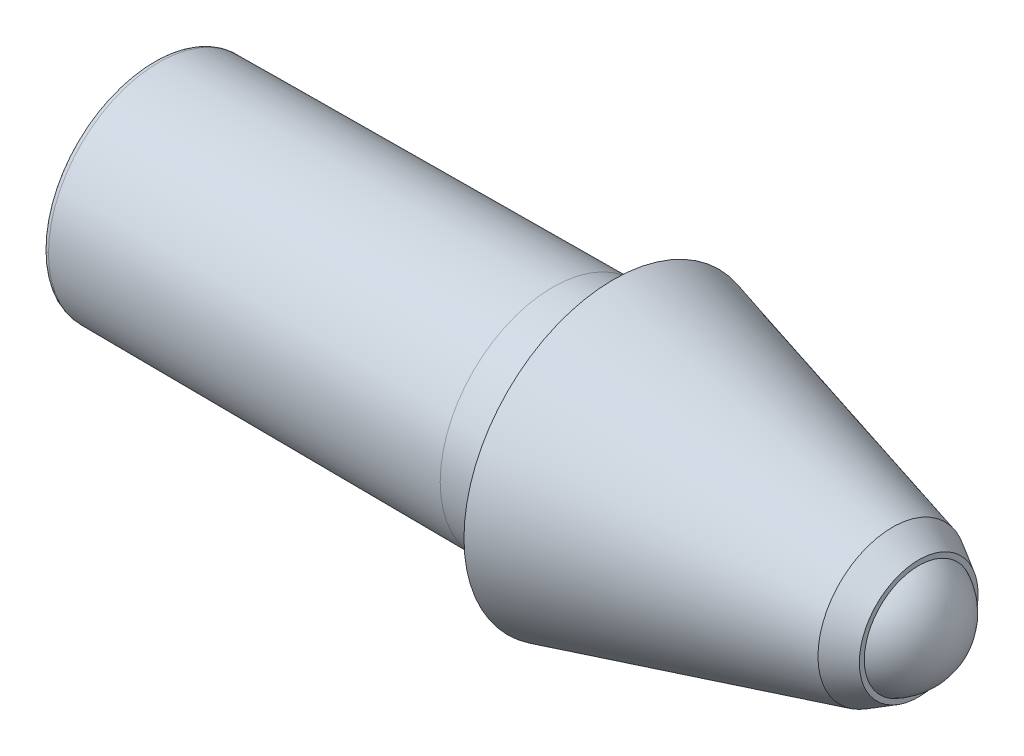
ISO-10303-21;
HEADER;
FILE_DESCRIPTION(('STEP AP214'),'2;1');
FILE_NAME('part.step','',(''),(''),'','','');
FILE_SCHEMA(('AUTOMOTIVE_DESIGN { 1 0 10303 214 1 1 1 1 }'));
ENDSEC;
DATA;
#1=APPLICATION_CONTEXT('core data for automotive mechanical design processes');
#2=APPLICATION_PROTOCOL_DEFINITION('international standard','automotive_design',2000,#1);
#3=PRODUCT_CONTEXT('',#1,'mechanical');
#4=PRODUCT('Part','Part','',(#3));
#5=PRODUCT_RELATED_PRODUCT_CATEGORY('part','',(#4));
#6=PRODUCT_DEFINITION_FORMATION('','',#4);
#7=PRODUCT_DEFINITION_CONTEXT('part definition',#1,'design');
#8=PRODUCT_DEFINITION('design','',#6,#7);
#9=PRODUCT_DEFINITION_SHAPE('','',#8);
#10=(LENGTH_UNIT() NAMED_UNIT(*) SI_UNIT(.MILLI.,.METRE.));
#11=(NAMED_UNIT(*) PLANE_ANGLE_UNIT() SI_UNIT($,.RADIAN.));
#12=(NAMED_UNIT(*) SI_UNIT($,.STERADIAN.) SOLID_ANGLE_UNIT());
#13=UNCERTAINTY_MEASURE_WITH_UNIT(LENGTH_MEASURE(1.E-05),#10,'distance_accuracy_value','');
#14=(GEOMETRIC_REPRESENTATION_CONTEXT(3) GLOBAL_UNCERTAINTY_ASSIGNED_CONTEXT((#13)) GLOBAL_UNIT_ASSIGNED_CONTEXT((#10,
#11,#12)) REPRESENTATION_CONTEXT('',''));
#15=CARTESIAN_POINT('',(0.,0.,0.));
#16=DIRECTION('',(0.,0.,1.));
#17=DIRECTION('',(1.,0.,0.));
#18=AXIS2_PLACEMENT_3D('',#15,#16,#17);
#19=CARTESIAN_POINT('',(6.1,0.,0.));
#20=DIRECTION('',(-1.,0.,0.));
#21=DIRECTION('',(0.,1.,0.));
#22=AXIS2_PLACEMENT_3D('',#19,#20,#21);
#23=SPHERICAL_SURFACE('',#22,0.5);
#24=CARTESIAN_POINT('',(5.6,0.,0.));
#25=VERTEX_POINT('',#24);
#26=VERTEX_LOOP('',#25);
#27=FACE_BOUND('',#26,.T.);
#28=ADVANCED_FACE('F44',(#27),#23,.T.);
#29=CLOSED_SHELL('',(#28));
#30=MANIFOLD_SOLID_BREP('B2',#29);
#31=CARTESIAN_POINT('',(6.1,0.,0.));
#32=DIRECTION('',(-1.,0.,0.));
#33=DIRECTION('',(0.,1.,0.));
#34=AXIS2_PLACEMENT_3D('',#31,#32,#33);
#35=SPHERICAL_SURFACE('',#34,0.5);
#36=CARTESIAN_POINT('',(6.32,0.,0.));
#37=DIRECTION('',(-1.,0.,0.));
#38=DIRECTION('',(0.,0.,1.));
#39=AXIS2_PLACEMENT_3D('',#36,#37,#38);
#40=CIRCLE('',#39,0.448998886412873);
#41=CARTESIAN_POINT('',(6.32,0.,0.448998886412873));
#42=VERTEX_POINT('',#41);
#43=EDGE_CURVE('E127',#42,#42,#40,.T.);
#44=ORIENTED_EDGE('',*,*,#43,.F.);
#45=EDGE_LOOP('',(#44));
#46=FACE_BOUND('',#45,.T.);
#47=CARTESIAN_POINT('',(6.1,0.,0.));
#48=DIRECTION('',(-1.,0.,0.));
#49=DIRECTION('',(0.,0.,1.));
#50=AXIS2_PLACEMENT_3D('',#47,#48,#49);
#51=CIRCLE('',#50,0.5);
#52=CARTESIAN_POINT('',(6.1,0.,0.5));
#53=VERTEX_POINT('',#52);
#54=EDGE_CURVE('E43',#53,#53,#51,.T.);
#55=ORIENTED_EDGE('',*,*,#54,.T.);
#56=EDGE_LOOP('',(#55));
#57=FACE_BOUND('',#56,.T.);
#58=ADVANCED_FACE('F58',(#46,#57),#35,.F.);
#59=CARTESIAN_POINT('',(-2.,0.,0.));
#60=DIRECTION('',(-1.,0.,0.));
#61=DIRECTION('',(0.,0.,1.));
#62=AXIS2_PLACEMENT_3D('',#59,#60,#61);
#63=CYLINDRICAL_SURFACE('',#62,0.5);
#64=ORIENTED_EDGE('',*,*,#54,.F.);
#65=EDGE_LOOP('',(#64));
#66=FACE_BOUND('',#65,.T.);
#67=CARTESIAN_POINT('',(5.89289321881345,0.,0.));
#68=DIRECTION('',(-1.,0.,0.));
#69=DIRECTION('',(0.,0.,1.));
#70=AXIS2_PLACEMENT_3D('',#67,#68,#69);
#71=CIRCLE('',#70,0.5);
#72=CARTESIAN_POINT('',(5.89289321881345,0.,0.5));
#73=VERTEX_POINT('',#72);
#74=EDGE_CURVE('E65',#73,#73,#71,.T.);
#75=ORIENTED_EDGE('',*,*,#74,.T.);
#76=EDGE_LOOP('',(#75));
#77=FACE_BOUND('',#76,.T.);
#78=ADVANCED_FACE('F136',(#66,#77),#63,.F.);
#79=CARTESIAN_POINT('',(5.64289321881345,0.,0.));
#80=DIRECTION('',(1.,0.,0.));
#81=DIRECTION('',(0.,0.,-1.));
#82=AXIS2_PLACEMENT_3D('',#79,#80,#81);
#83=CONICAL_SURFACE('',#82,0.25,0.785398163397448);
#84=ORIENTED_EDGE('',*,*,#74,.F.);
#85=EDGE_LOOP('',(#84));
#86=FACE_BOUND('',#85,.T.);
#87=CARTESIAN_POINT('',(5.64289321881345,0.,0.));
#88=DIRECTION('',(-1.,0.,0.));
#89=DIRECTION('',(0.,0.,1.));
#90=AXIS2_PLACEMENT_3D('',#87,#88,#89);
#91=CIRCLE('',#90,0.25);
#92=CARTESIAN_POINT('',(5.64289321881345,0.,0.25));
#93=VERTEX_POINT('',#92);
#94=EDGE_CURVE('E71',#93,#93,#91,.T.);
#95=ORIENTED_EDGE('',*,*,#94,.T.);
#96=EDGE_LOOP('',(#95));
#97=FACE_BOUND('',#96,.T.);
#98=ADVANCED_FACE('F140',(#86,#97),#83,.F.);
#99=CARTESIAN_POINT('',(-2.,0.,0.));
#100=DIRECTION('',(-1.,0.,0.));
#101=DIRECTION('',(0.,0.,1.));
#102=AXIS2_PLACEMENT_3D('',#99,#100,#101);
#103=CYLINDRICAL_SURFACE('',#102,0.25);
#104=ORIENTED_EDGE('',*,*,#94,.F.);
#105=EDGE_LOOP('',(#104));
#106=FACE_BOUND('',#105,.T.);
#107=CARTESIAN_POINT('',(5.08660254037844,0.,0.));
#108=DIRECTION('',(-1.,0.,0.));
#109=DIRECTION('',(0.,0.,1.));
#110=AXIS2_PLACEMENT_3D('',#107,#108,#109);
#111=CIRCLE('',#110,0.25);
#112=CARTESIAN_POINT('',(5.08660254037844,0.,0.25));
#113=VERTEX_POINT('',#112);
#114=EDGE_CURVE('E77',#113,#113,#111,.T.);
#115=ORIENTED_EDGE('',*,*,#114,.T.);
#116=EDGE_LOOP('',(#115));
#117=FACE_BOUND('',#116,.T.);
#118=ADVANCED_FACE('F145',(#106,#117),#103,.F.);
#119=CARTESIAN_POINT('',(5.,0.,0.));
#120=DIRECTION('',(-1.,0.,0.));
#121=DIRECTION('',(0.,0.,1.));
#122=AXIS2_PLACEMENT_3D('',#119,#120,#121);
#123=CONICAL_SURFACE('',#122,0.4,1.04719755119661);
#124=ORIENTED_EDGE('',*,*,#114,.F.);
#125=EDGE_LOOP('',(#124));
#126=FACE_BOUND('',#125,.T.);
#127=CARTESIAN_POINT('',(5.,0.,0.));
#128=DIRECTION('',(-1.,0.,0.));
#129=DIRECTION('',(0.,0.,1.));
#130=AXIS2_PLACEMENT_3D('',#127,#128,#129);
#131=CIRCLE('',#130,0.4);
#132=CARTESIAN_POINT('',(5.,0.,0.4));
#133=VERTEX_POINT('',#132);
#134=EDGE_CURVE('E83',#133,#133,#131,.T.);
#135=ORIENTED_EDGE('',*,*,#134,.T.);
#136=EDGE_LOOP('',(#135));
#137=FACE_BOUND('',#136,.T.);
#138=ADVANCED_FACE('F151',(#126,#137),#123,.F.);
#139=CARTESIAN_POINT('',(-2.,0.,0.));
#140=DIRECTION('',(-1.,0.,0.));
#141=DIRECTION('',(0.,0.,1.));
#142=AXIS2_PLACEMENT_3D('',#139,#140,#141);
#143=CYLINDRICAL_SURFACE('',#142,0.4);
#144=ORIENTED_EDGE('',*,*,#134,.F.);
#145=EDGE_LOOP('',(#144));
#146=FACE_BOUND('',#145,.T.);
#147=CARTESIAN_POINT('',(3.72886751345948,0.,0.));
#148=DIRECTION('',(-1.,0.,0.));
#149=DIRECTION('',(0.,0.,1.));
#150=AXIS2_PLACEMENT_3D('',#147,#148,#149);
#151=CIRCLE('',#150,0.4);
#152=CARTESIAN_POINT('',(3.72886751345948,0.,0.4));
#153=VERTEX_POINT('',#152);
#154=EDGE_CURVE('E87',#153,#153,#151,.T.);
#155=ORIENTED_EDGE('',*,*,#154,.T.);
#156=EDGE_LOOP('',(#155));
#157=FACE_BOUND('',#156,.T.);
#158=ADVANCED_FACE('F155',(#146,#157),#143,.F.);
#159=CARTESIAN_POINT('',(3.7,0.,0.));
#160=DIRECTION('',(-1.,0.,0.));
#161=DIRECTION('',(0.,0.,1.));
#162=AXIS2_PLACEMENT_3D('',#159,#160,#161);
#163=CONICAL_SURFACE('',#162,0.45,1.04719755119662);
#164=ORIENTED_EDGE('',*,*,#154,.F.);
#165=EDGE_LOOP('',(#164));
#166=FACE_BOUND('',#165,.T.);
#167=CARTESIAN_POINT('',(3.7,0.,0.));
#168=DIRECTION('',(-1.,0.,0.));
#169=DIRECTION('',(0.,0.,1.));
#170=AXIS2_PLACEMENT_3D('',#167,#168,#169);
#171=CIRCLE('',#170,0.45);
#172=CARTESIAN_POINT('',(3.7,0.,0.45));
#173=VERTEX_POINT('',#172);
#174=EDGE_CURVE('E91',#173,#173,#171,.T.);
#175=ORIENTED_EDGE('',*,*,#174,.T.);
#176=EDGE_LOOP('',(#175));
#177=FACE_BOUND('',#176,.T.);
#178=ADVANCED_FACE('F159',(#166,#177),#163,.F.);
#179=CARTESIAN_POINT('',(-2.,0.,0.));
#180=DIRECTION('',(-1.,0.,0.));
#181=DIRECTION('',(0.,0.,1.));
#182=AXIS2_PLACEMENT_3D('',#179,#180,#181);
#183=CYLINDRICAL_SURFACE('',#182,0.45);
#184=ORIENTED_EDGE('',*,*,#174,.F.);
#185=EDGE_LOOP('',(#184));
#186=FACE_BOUND('',#185,.T.);
#187=CARTESIAN_POINT('',(0.,0.,0.));
#188=DIRECTION('',(-1.,0.,0.));
#189=DIRECTION('',(0.,0.,1.));
#190=AXIS2_PLACEMENT_3D('',#187,#188,#189);
#191=CIRCLE('',#190,0.45);
#192=CARTESIAN_POINT('',(0.,0.,0.45));
#193=VERTEX_POINT('',#192);
#194=EDGE_CURVE('E95',#193,#193,#191,.T.);
#195=ORIENTED_EDGE('',*,*,#194,.T.);
#196=EDGE_LOOP('',(#195));
#197=FACE_BOUND('',#196,.T.);
#198=ADVANCED_FACE('F163',(#186,#197),#183,.F.);
#199=CARTESIAN_POINT('',(0.,0.45,0.));
#200=DIRECTION('',(1.,0.,0.));
#201=DIRECTION('',(0.,0.,-1.));
#202=AXIS2_PLACEMENT_3D('',#199,#200,#201);
#203=PLANE('',#202);
#204=ORIENTED_EDGE('',*,*,#194,.F.);
#205=EDGE_LOOP('',(#204));
#206=FACE_BOUND('',#205,.T.);
#207=CARTESIAN_POINT('',(0.,0.,0.));
#208=DIRECTION('',(-1.,0.,0.));
#209=DIRECTION('',(0.,0.,1.));
#210=AXIS2_PLACEMENT_3D('',#207,#208,#209);
#211=CIRCLE('',#210,0.860277006178793);
#212=CARTESIAN_POINT('',(0.,0.,0.860277006178793));
#213=VERTEX_POINT('',#212);
#214=EDGE_CURVE('E99',#213,#213,#211,.T.);
#215=ORIENTED_EDGE('',*,*,#214,.T.);
#216=EDGE_LOOP('',(#215));
#217=FACE_BOUND('',#216,.T.);
#218=ADVANCED_FACE('F167',(#206,#217),#203,.F.);
#219=CARTESIAN_POINT('',(0.0500000000000014,0.,0.));
#220=DIRECTION('',(-1.,0.,0.));
#221=DIRECTION('',(0.,0.,1.));
#222=AXIS2_PLACEMENT_3D('',#219,#220,#221);
#223=TOROIDAL_SURFACE('',#222,0.860277006178793,0.0499996142064612);
#224=ORIENTED_EDGE('',*,*,#214,.F.);
#225=EDGE_LOOP('',(#224));
#226=FACE_BOUND('',#225,.T.);
#227=CARTESIAN_POINT('',(0.0500000000000014,0.,0.));
#228=DIRECTION('',(-1.,0.,0.));
#229=DIRECTION('',(0.,0.,1.));
#230=AXIS2_PLACEMENT_3D('',#227,#228,#229);
#231=CIRCLE('',#230,0.910276620385254);
#232=CARTESIAN_POINT('',(0.0500000000000014,0.,0.910276620385254));
#233=VERTEX_POINT('',#232);
#234=EDGE_CURVE('E103',#233,#233,#231,.T.);
#235=ORIENTED_EDGE('',*,*,#234,.T.);
#236=EDGE_LOOP('',(#235));
#237=FACE_BOUND('',#236,.T.);
#238=ADVANCED_FACE('F171',(#226,#237),#223,.T.);
#239=CARTESIAN_POINT('',(3.3,0.,0.));
#240=DIRECTION('',(1.,0.,0.));
#241=DIRECTION('',(0.,0.,-1.));
#242=AXIS2_PLACEMENT_3D('',#239,#240,#241);
#243=CONICAL_SURFACE('',#242,0.928238764373819,0.00552675726257088);
#244=ORIENTED_EDGE('',*,*,#234,.F.);
#245=EDGE_LOOP('',(#244));
#246=FACE_BOUND('',#245,.T.);
#247=CARTESIAN_POINT('',(3.3,0.,0.));
#248=DIRECTION('',(-1.,0.,0.));
#249=DIRECTION('',(0.,0.,1.));
#250=AXIS2_PLACEMENT_3D('',#247,#248,#249);
#251=CIRCLE('',#250,0.928238764373819);
#252=CARTESIAN_POINT('',(3.3,0.,0.928238764373819));
#253=VERTEX_POINT('',#252);
#254=EDGE_CURVE('E107',#253,#253,#251,.T.);
#255=ORIENTED_EDGE('',*,*,#254,.T.);
#256=EDGE_LOOP('',(#255));
#257=FACE_BOUND('',#256,.T.);
#258=ADVANCED_FACE('F175',(#246,#257),#243,.T.);
#259=CARTESIAN_POINT('',(-2.,0.,0.));
#260=DIRECTION('',(-1.,0.,0.));
#261=DIRECTION('',(0.,0.,1.));
#262=AXIS2_PLACEMENT_3D('',#259,#260,#261);
#263=CYLINDRICAL_SURFACE('',#262,0.928238764373819);
#264=ORIENTED_EDGE('',*,*,#254,.F.);
#265=EDGE_LOOP('',(#264));
#266=FACE_BOUND('',#265,.T.);
#267=CARTESIAN_POINT('',(3.8,0.,0.));
#268=DIRECTION('',(-1.,0.,0.));
#269=DIRECTION('',(0.,0.,1.));
#270=AXIS2_PLACEMENT_3D('',#267,#268,#269);
#271=CIRCLE('',#270,0.928238764373819);
#272=CARTESIAN_POINT('',(3.8,0.,0.928238764373819));
#273=VERTEX_POINT('',#272);
#274=EDGE_CURVE('E111',#273,#273,#271,.T.);
#275=ORIENTED_EDGE('',*,*,#274,.T.);
#276=EDGE_LOOP('',(#275));
#277=FACE_BOUND('',#276,.T.);
#278=ADVANCED_FACE('F179',(#266,#277),#263,.T.);
#279=CARTESIAN_POINT('',(3.8,1.15,0.));
#280=DIRECTION('',(1.,0.,0.));
#281=DIRECTION('',(0.,0.,-1.));
#282=AXIS2_PLACEMENT_3D('',#279,#280,#281);
#283=PLANE('',#282);
#284=ORIENTED_EDGE('',*,*,#274,.F.);
#285=EDGE_LOOP('',(#284));
#286=FACE_BOUND('',#285,.T.);
#287=CARTESIAN_POINT('',(3.8,0.,0.));
#288=DIRECTION('',(-1.,0.,0.));
#289=DIRECTION('',(0.,0.,1.));
#290=AXIS2_PLACEMENT_3D('',#287,#288,#289);
#291=CIRCLE('',#290,1.23221926303419);
#292=CARTESIAN_POINT('',(3.8,0.,1.23221926303419));
#293=VERTEX_POINT('',#292);
#294=EDGE_CURVE('E115',#293,#293,#291,.T.);
#295=ORIENTED_EDGE('',*,*,#294,.T.);
#296=EDGE_LOOP('',(#295));
#297=FACE_BOUND('',#296,.T.);
#298=ADVANCED_FACE('F183',(#286,#297),#283,.F.);
#299=CARTESIAN_POINT('',(6.10349364905389,0.,0.));
#300=DIRECTION('',(-1.,0.,0.));
#301=DIRECTION('',(0.,0.,1.));
#302=AXIS2_PLACEMENT_3D('',#299,#300,#301);
#303=CONICAL_SURFACE('',#302,0.615,0.261799387799142);
#304=ORIENTED_EDGE('',*,*,#294,.F.);
#305=EDGE_LOOP('',(#304));
#306=FACE_BOUND('',#305,.T.);
#307=CARTESIAN_POINT('',(6.10349364905389,0.,0.));
#308=DIRECTION('',(-1.,0.,0.));
#309=DIRECTION('',(0.,0.,1.));
#310=AXIS2_PLACEMENT_3D('',#307,#308,#309);
#311=CIRCLE('',#310,0.615);
#312=CARTESIAN_POINT('',(6.10349364905389,0.,0.615));
#313=VERTEX_POINT('',#312);
#314=EDGE_CURVE('E119',#313,#313,#311,.T.);
#315=ORIENTED_EDGE('',*,*,#314,.T.);
#316=EDGE_LOOP('',(#315));
#317=FACE_BOUND('',#316,.T.);
#318=ADVANCED_FACE('F187',(#306,#317),#303,.T.);
#319=CARTESIAN_POINT('',(6.32,0.,0.));
#320=DIRECTION('',(-1.,0.,0.));
#321=DIRECTION('',(0.,0.,1.));
#322=AXIS2_PLACEMENT_3D('',#319,#320,#321);
#323=CONICAL_SURFACE('',#322,0.49,0.523598775598293);
#324=ORIENTED_EDGE('',*,*,#314,.F.);
#325=EDGE_LOOP('',(#324));
#326=FACE_BOUND('',#325,.T.);
#327=CARTESIAN_POINT('',(6.32,0.,0.));
#328=DIRECTION('',(-1.,0.,0.));
#329=DIRECTION('',(0.,0.,1.));
#330=AXIS2_PLACEMENT_3D('',#327,#328,#329);
#331=CIRCLE('',#330,0.49);
#332=CARTESIAN_POINT('',(6.32,0.,0.49));
#333=VERTEX_POINT('',#332);
#334=EDGE_CURVE('E123',#333,#333,#331,.T.);
#335=ORIENTED_EDGE('',*,*,#334,.T.);
#336=EDGE_LOOP('',(#335));
#337=FACE_BOUND('',#336,.T.);
#338=ADVANCED_FACE('F191',(#326,#337),#323,.T.);
#339=CARTESIAN_POINT('',(6.32,0.49,0.));
#340=DIRECTION('',(-1.,0.,0.));
#341=DIRECTION('',(0.,0.,1.));
#342=AXIS2_PLACEMENT_3D('',#339,#340,#341);
#343=PLANE('',#342);
#344=ORIENTED_EDGE('',*,*,#334,.F.);
#345=EDGE_LOOP('',(#344));
#346=FACE_BOUND('',#345,.T.);
#347=ORIENTED_EDGE('',*,*,#43,.T.);
#348=EDGE_LOOP('',(#347));
#349=FACE_BOUND('',#348,.T.);
#350=ADVANCED_FACE('F133',(#346,#349),#343,.F.);
#351=CLOSED_SHELL('',(#58,#78,#98,#118,#138,#158,#178,#198,#218,#238,#258,#278,#298,#318,#338,#350));
#352=MANIFOLD_SOLID_BREP('B6',#351);
#353=ADVANCED_BREP_SHAPE_REPRESENTATION('',(#18,#30,#352),#14);
#354=SHAPE_DEFINITION_REPRESENTATION(#9,#353);
ENDSEC;
END-ISO-10303-21;
